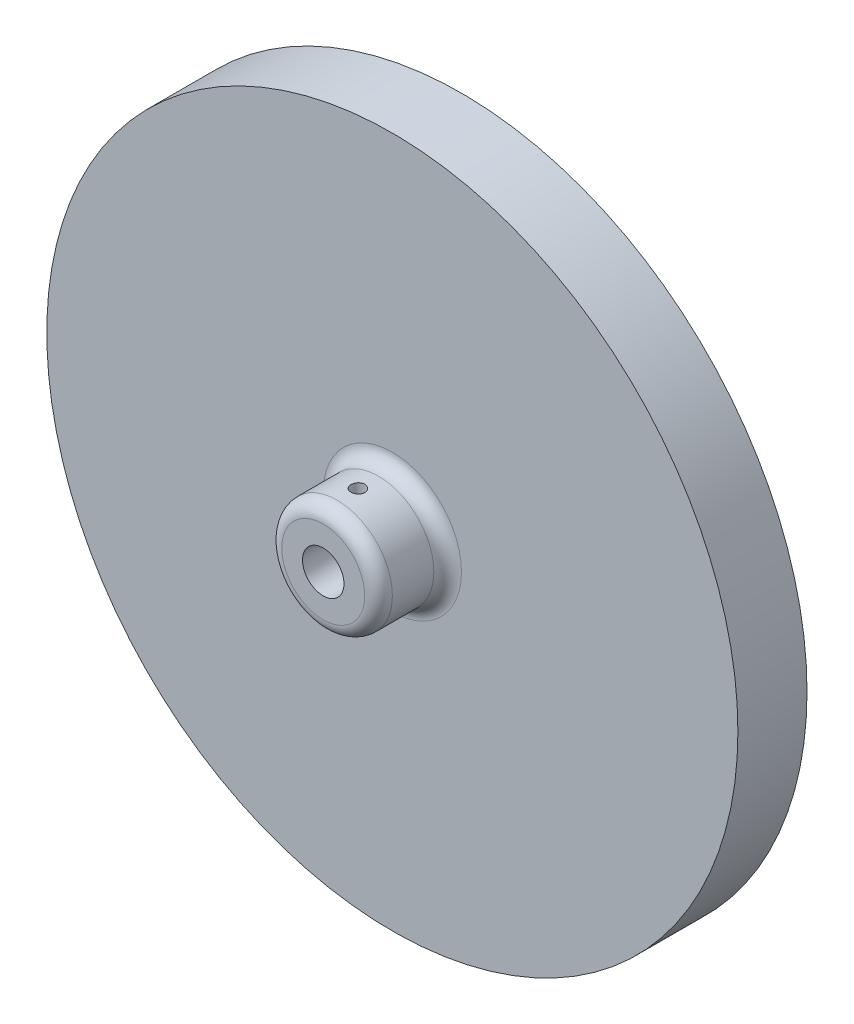
ISO-10303-21;
HEADER;
FILE_DESCRIPTION(('STEP AP214'),'2;1');
FILE_NAME('part.step','',(''),(''),'','','');
FILE_SCHEMA(('AUTOMOTIVE_DESIGN { 1 0 10303 214 1 1 1 1 }'));
ENDSEC;
DATA;
#1=APPLICATION_CONTEXT('core data for automotive mechanical design processes');
#2=APPLICATION_PROTOCOL_DEFINITION('international standard','automotive_design',2000,#1);
#3=PRODUCT_CONTEXT('',#1,'mechanical');
#4=PRODUCT('Part','Part','',(#3));
#5=PRODUCT_RELATED_PRODUCT_CATEGORY('part','',(#4));
#6=PRODUCT_DEFINITION_FORMATION('','',#4);
#7=PRODUCT_DEFINITION_CONTEXT('part definition',#1,'design');
#8=PRODUCT_DEFINITION('design','',#6,#7);
#9=PRODUCT_DEFINITION_SHAPE('','',#8);
#10=(LENGTH_UNIT() NAMED_UNIT(*) SI_UNIT(.MILLI.,.METRE.));
#11=(NAMED_UNIT(*) PLANE_ANGLE_UNIT() SI_UNIT($,.RADIAN.));
#12=(NAMED_UNIT(*) SI_UNIT($,.STERADIAN.) SOLID_ANGLE_UNIT());
#13=UNCERTAINTY_MEASURE_WITH_UNIT(LENGTH_MEASURE(1.E-05),#10,'distance_accuracy_value','');
#14=(GEOMETRIC_REPRESENTATION_CONTEXT(3) GLOBAL_UNCERTAINTY_ASSIGNED_CONTEXT((#13)) GLOBAL_UNIT_ASSIGNED_CONTEXT((#10,
#11,#12)) REPRESENTATION_CONTEXT('',''));
#15=CARTESIAN_POINT('',(0.,0.,0.));
#16=DIRECTION('',(0.,0.,1.));
#17=DIRECTION('',(1.,0.,0.));
#18=AXIS2_PLACEMENT_3D('',#15,#16,#17);
#19=CARTESIAN_POINT('',(0.,0.,5.));
#20=DIRECTION('',(0.,0.,-1.));
#21=DIRECTION('',(-1.,0.,0.));
#22=AXIS2_PLACEMENT_3D('',#19,#20,#21);
#23=CYLINDRICAL_SURFACE('',#22,50.);
#24=CARTESIAN_POINT('',(0.,0.,5.));
#25=DIRECTION('',(0.,0.,1.));
#26=DIRECTION('',(1.,0.,0.));
#27=AXIS2_PLACEMENT_3D('',#24,#25,#26);
#28=CIRCLE('',#27,50.);
#29=CARTESIAN_POINT('',(50.,0.,5.));
#30=VERTEX_POINT('',#29);
#31=EDGE_CURVE('E107',#30,#30,#28,.T.);
#32=ORIENTED_EDGE('',*,*,#31,.F.);
#33=EDGE_LOOP('',(#32));
#34=FACE_BOUND('',#33,.T.);
#35=CARTESIAN_POINT('',(0.,0.,-5.));
#36=DIRECTION('',(0.,0.,1.));
#37=DIRECTION('',(1.,0.,0.));
#38=AXIS2_PLACEMENT_3D('',#35,#36,#37);
#39=CIRCLE('',#38,50.);
#40=CARTESIAN_POINT('',(50.,0.,-5.));
#41=VERTEX_POINT('',#40);
#42=EDGE_CURVE('E111',#41,#41,#39,.T.);
#43=ORIENTED_EDGE('',*,*,#42,.T.);
#44=EDGE_LOOP('',(#43));
#45=FACE_BOUND('',#44,.T.);
#46=ADVANCED_FACE('F30',(#34,#45),#23,.T.);
#47=CARTESIAN_POINT('',(0.,0.,5.));
#48=DIRECTION('',(0.,0.,1.));
#49=DIRECTION('',(1.,0.,0.));
#50=AXIS2_PLACEMENT_3D('',#47,#48,#49);
#51=PLANE('',#50);
#52=CARTESIAN_POINT('',(0.,0.,5.));
#53=DIRECTION('',(0.,0.,1.));
#54=DIRECTION('',(1.,0.,0.));
#55=AXIS2_PLACEMENT_3D('',#52,#53,#54);
#56=CIRCLE('',#55,10.);
#57=CARTESIAN_POINT('',(10.,0.,5.));
#58=VERTEX_POINT('',#57);
#59=EDGE_CURVE('E10',#58,#58,#56,.F.);
#60=ORIENTED_EDGE('',*,*,#59,.T.);
#61=EDGE_LOOP('',(#60));
#62=FACE_BOUND('',#61,.T.);
#63=ORIENTED_EDGE('',*,*,#31,.T.);
#64=EDGE_LOOP('',(#63));
#65=FACE_BOUND('',#64,.T.);
#66=ADVANCED_FACE('F83',(#62,#65),#51,.T.);
#67=CARTESIAN_POINT('',(0.,0.,-5.));
#68=DIRECTION('',(0.,0.,1.));
#69=DIRECTION('',(1.,0.,0.));
#70=AXIS2_PLACEMENT_3D('',#67,#68,#69);
#71=PLANE('',#70);
#72=CARTESIAN_POINT('',(0.,0.,-5.));
#73=DIRECTION('',(0.,0.,1.));
#74=DIRECTION('',(1.,0.,0.));
#75=AXIS2_PLACEMENT_3D('',#72,#73,#74);
#76=CIRCLE('',#75,3.);
#77=CARTESIAN_POINT('',(3.,0.,-5.));
#78=VERTEX_POINT('',#77);
#79=EDGE_CURVE('E115',#78,#78,#76,.T.);
#80=ORIENTED_EDGE('',*,*,#79,.T.);
#81=EDGE_LOOP('',(#80));
#82=FACE_BOUND('',#81,.T.);
#83=ORIENTED_EDGE('',*,*,#42,.F.);
#84=EDGE_LOOP('',(#83));
#85=FACE_BOUND('',#84,.T.);
#86=ADVANCED_FACE('F81',(#82,#85),#71,.F.);
#87=CARTESIAN_POINT('',(0.,0.,15.));
#88=DIRECTION('',(0.,0.,-1.));
#89=DIRECTION('',(-1.,0.,0.));
#90=AXIS2_PLACEMENT_3D('',#87,#88,#89);
#91=CYLINDRICAL_SURFACE('',#90,8.);
#92=CARTESIAN_POINT('',(0.,-8.,11.));
#93=CARTESIAN_POINT('',(0.0559364382223045,-7.99999921958571,10.9999976236257));
#94=CARTESIAN_POINT('',(0.111907829721099,-7.99940713821961,10.9952908483323));
#95=CARTESIAN_POINT('',(0.222293120835901,-7.99710216044544,10.9765888981717));
#96=CARTESIAN_POINT('',(0.276705332249498,-7.99538809376571,10.9625840248306));
#97=CARTESIAN_POINT('',(0.382358229925222,-7.99103224417762,10.9257049424344));
#98=CARTESIAN_POINT('',(0.433601024058456,-7.98839108582217,10.9028367032761));
#99=CARTESIAN_POINT('',(0.531511789957215,-7.98247480351239,10.8488930864121));
#100=CARTESIAN_POINT('',(0.578180544622549,-7.97919978833646,10.8178191165877));
#101=CARTESIAN_POINT('',(0.665885126772527,-7.9723612852253,10.7481632200642));
#102=CARTESIAN_POINT('',(0.706892145974851,-7.96879645876967,10.7095451482615));
#103=CARTESIAN_POINT('',(0.781861117422998,-7.961790904039,10.6259748705853));
#104=CARTESIAN_POINT('',(0.815822710556901,-7.95835018209707,10.5810223420347));
#105=CARTESIAN_POINT('',(0.875844064513576,-7.95196922247834,10.4858720089737));
#106=CARTESIAN_POINT('',(0.901876838376429,-7.94903070871164,10.4356570553728));
#107=CARTESIAN_POINT('',(0.945129230630047,-7.94400451383073,10.3315251792211));
#108=CARTESIAN_POINT('',(0.962349183226086,-7.94191680045254,10.2776083971412));
#109=CARTESIAN_POINT('',(0.987399592009906,-7.93884135841445,10.1679023217653));
#110=CARTESIAN_POINT('',(0.995278685892681,-7.93784793374698,10.1121242969183));
#111=CARTESIAN_POINT('',(1.00157421982289,-7.93705611257117,10.0000294946113));
#112=CARTESIAN_POINT('',(0.999991040400967,-7.93725766800603,9.94371273890748));
#113=CARTESIAN_POINT('',(0.987446894579161,-7.93882782147901,9.83247806910049));
#114=CARTESIAN_POINT('',(0.976539505193879,-7.94018975184131,9.77755400551989));
#115=CARTESIAN_POINT('',(0.94574015327282,-7.94391679903051,9.6703219915124));
#116=CARTESIAN_POINT('',(0.925848008700761,-7.94628193618289,9.61801409411438));
#117=CARTESIAN_POINT('',(0.87758622396466,-7.9517564634586,9.51733280039132));
#118=CARTESIAN_POINT('',(0.849193301483054,-7.95486789284578,9.4689706799004));
#119=CARTESIAN_POINT('',(0.784752587782767,-7.96148284572239,9.3776773222347));
#120=CARTESIAN_POINT('',(0.74870444643231,-7.96498638714265,9.33474633361053));
#121=CARTESIAN_POINT('',(0.669679644301511,-7.9720204395617,9.2552229157109));
#122=CARTESIAN_POINT('',(0.626656803136005,-7.97555096954756,9.21867636329361));
#123=CARTESIAN_POINT('',(0.53506286764557,-7.98221853022341,9.15331644798778));
#124=CARTESIAN_POINT('',(0.486491760527301,-7.98535556000602,9.1245031029312));
#125=CARTESIAN_POINT('',(0.385144668545392,-7.99088460887432,9.07542747181443));
#126=CARTESIAN_POINT('',(0.332367278135087,-7.99327637760615,9.05516805844751));
#127=CARTESIAN_POINT('',(0.224123176172422,-7.99704314312025,9.0238118025907));
#128=CARTESIAN_POINT('',(0.168656590652266,-7.99841818750348,9.01271453114518));
#129=CARTESIAN_POINT('',(0.0570052655653982,-7.99999038564304,9.00005703029578));
#130=CARTESIAN_POINT('',(0.000827796079442151,-8.00019534457054,8.99843360305437));
#131=CARTESIAN_POINT('',(-0.110998414598999,-7.99942535202172,9.00460309362238));
#132=CARTESIAN_POINT('',(-0.166647167025883,-7.99845042567285,9.01239581090064));
#133=CARTESIAN_POINT('',(-0.275649803088609,-7.99543507502677,9.03712388350975));
#134=CARTESIAN_POINT('',(-0.329010628169883,-7.99339816325548,9.05402910536105));
#135=CARTESIAN_POINT('',(-0.432139861943363,-7.98848689240079,9.09647098076517));
#136=CARTESIAN_POINT('',(-0.481908148586126,-7.98561250488249,9.12200792739657));
#137=CARTESIAN_POINT('',(-0.576721808274971,-7.97932729164045,9.18114125500298));
#138=CARTESIAN_POINT('',(-0.621741503977528,-7.97591377617004,9.21477851592226));
#139=CARTESIAN_POINT('',(-0.705518795850528,-7.96894056930262,9.28909979901368));
#140=CARTESIAN_POINT('',(-0.744276143334744,-7.96538087210759,9.3297841009004));
#141=CARTESIAN_POINT('',(-0.814652783527207,-7.95849242185034,9.41732296670286));
#142=CARTESIAN_POINT('',(-0.846230184227173,-7.9551650988853,9.46421133852416));
#143=CARTESIAN_POINT('',(-0.901061155777402,-7.94914164414859,9.56266329794189));
#144=CARTESIAN_POINT('',(-0.924314893491347,-7.94644549972411,9.61422679179061));
#145=CARTESIAN_POINT('',(-0.961770631546616,-7.94199940157198,9.72043012765905));
#146=CARTESIAN_POINT('',(-0.975996250982844,-7.94024698073915,9.77506153201919));
#147=CARTESIAN_POINT('',(-0.995067997547139,-7.93787966362982,9.88596099351227));
#148=CARTESIAN_POINT('',(-0.999914561014305,-7.93726471443511,9.9422289743836));
#149=CARTESIAN_POINT('',(-1.00008261443393,-7.93724350792982,10.0543875716819));
#150=CARTESIAN_POINT('',(-0.99546991907971,-7.93782889900781,10.1102780993328));
#151=CARTESIAN_POINT('',(-0.976989761939731,-7.94012445814881,10.220482851738));
#152=CARTESIAN_POINT('',(-0.963122299162308,-7.94183462633232,10.2747970763235));
#153=CARTESIAN_POINT('',(-0.926546829475863,-7.9461844630982,10.3802987827066));
#154=CARTESIAN_POINT('',(-0.903841992388373,-7.94882379837113,10.4314873780087));
#155=CARTESIAN_POINT('',(-0.850242760860123,-7.95473513297927,10.5293386616193));
#156=CARTESIAN_POINT('',(-0.819348263803835,-7.95800714024165,10.5760012932079));
#157=CARTESIAN_POINT('',(-0.750002532506335,-7.96484241900893,10.6638124901362));
#158=CARTESIAN_POINT('',(-0.711502250309984,-7.96840748833613,10.704922184382));
#159=CARTESIAN_POINT('',(-0.628140090787354,-7.9754113263716,10.7801227300672));
#160=CARTESIAN_POINT('',(-0.583276715656627,-7.97885006510236,10.8142119243097));
#161=CARTESIAN_POINT('',(-0.488266248341684,-7.98522822634699,10.8745141428421));
#162=CARTESIAN_POINT('',(-0.438099711838468,-7.98816570031321,10.9006967223597));
#163=CARTESIAN_POINT('',(-0.334073160920512,-7.9931905963069,10.9442284971665));
#164=CARTESIAN_POINT('',(-0.280217232348094,-7.9952789414783,10.9615872905414));
#165=CARTESIAN_POINT('',(-0.18840230878717,-7.99786688131098,10.9828237352685));
#166=CARTESIAN_POINT('',(-0.151022265406768,-7.99866290358181,10.9892555767928));
#167=CARTESIAN_POINT('',(-0.075766825284974,-7.99972972531675,10.9978444982773));
#168=CARTESIAN_POINT('',(-0.0378914321984109,-8.00000052865388,11.0000016097597));
#169=CARTESIAN_POINT('',(0.,-8.,11.));
#170=B_SPLINE_CURVE_WITH_KNOTS('',3,(#92,#93,#94,#95,#96,#97,#98,#99,#100,#101,#102,#103,#104,
#105,#106,#107,#108,#109,#110,#111,#112,#113,#114,#115,#116,#117,#118,#119,#120,#121,#122,#123,
#124,#125,#126,#127,#128,#129,#130,#131,#132,#133,#134,#135,#136,#137,#138,#139,#140,#141,#142,
#143,#144,#145,#146,#147,#148,#149,#150,#151,#152,#153,#154,#155,#156,#157,#158,#159,#160,#161,
#162,#163,#164,#165,#166,#167,#168,#169),.UNSPECIFIED.,.T.,.F.,(4,2,2,2,2,2,2,2,2,2,2,2,2,2,2,2,
2,2,2,2,2,2,2,2,2,2,2,2,2,2,2,2,2,2,2,2,2,2,4),(0.,0.167670909110499,0.335516984377371,
0.503250203272709,0.670954662364293,0.839483252807373,1.00802043120004,1.17712500127548,
1.34622315798723,1.51443690114528,1.68264387953865,1.84989078576677,2.01714108066497,
2.18485370514214,2.35257400205455,2.52145391254567,2.69033421245245,2.85927118292642,
3.02820024361512,3.19600111756769,3.36379841800772,3.53104421557358,3.69829569231579,
3.86640961171369,4.03453020550035,4.2036078860303,4.37268217688616,4.5413122971237,
4.70993457204249,4.87738760480886,5.04484065551819,5.21223369882595,5.37962883964906,
5.54814095076732,5.71669279388005,5.88588561214742,6.05489399473613,6.16847537275052,
6.28205591320175),.UNSPECIFIED.);
#171=CARTESIAN_POINT('',(0.,-8.,11.));
#172=VERTEX_POINT('',#171);
#173=EDGE_CURVE('E72',#172,#172,#170,.T.);
#174=ORIENTED_EDGE('',*,*,#173,.T.);
#175=EDGE_LOOP('',(#174));
#176=FACE_BOUND('',#175,.T.);
#177=CARTESIAN_POINT('',(0.,8.,11.));
#178=CARTESIAN_POINT('',(-0.0559364382223045,7.99999921958571,10.9999976236257));
#179=CARTESIAN_POINT('',(-0.111907829721099,7.99940713821961,10.9952908483323));
#180=CARTESIAN_POINT('',(-0.222293120835901,7.99710216044544,10.9765888981717));
#181=CARTESIAN_POINT('',(-0.276705332249498,7.99538809376571,10.9625840248306));
#182=CARTESIAN_POINT('',(-0.382358229925222,7.99103224417762,10.9257049424344));
#183=CARTESIAN_POINT('',(-0.433601024058456,7.98839108582217,10.9028367032761));
#184=CARTESIAN_POINT('',(-0.531511789957215,7.98247480351239,10.8488930864121));
#185=CARTESIAN_POINT('',(-0.578180544622549,7.97919978833646,10.8178191165877));
#186=CARTESIAN_POINT('',(-0.665885126772527,7.9723612852253,10.7481632200642));
#187=CARTESIAN_POINT('',(-0.706892145974851,7.96879645876967,10.7095451482615));
#188=CARTESIAN_POINT('',(-0.781861117422998,7.961790904039,10.6259748705853));
#189=CARTESIAN_POINT('',(-0.815822710556901,7.95835018209707,10.5810223420347));
#190=CARTESIAN_POINT('',(-0.875844064513576,7.95196922247834,10.4858720089737));
#191=CARTESIAN_POINT('',(-0.901876838376429,7.94903070871164,10.4356570553728));
#192=CARTESIAN_POINT('',(-0.945129230630047,7.94400451383073,10.3315251792211));
#193=CARTESIAN_POINT('',(-0.962349183226086,7.94191680045254,10.2776083971412));
#194=CARTESIAN_POINT('',(-0.987399592009906,7.93884135841445,10.1679023217653));
#195=CARTESIAN_POINT('',(-0.995278685892681,7.93784793374698,10.1121242969183));
#196=CARTESIAN_POINT('',(-1.00157421982289,7.93705611257117,10.0000294946113));
#197=CARTESIAN_POINT('',(-0.999991040400967,7.93725766800603,9.94371273890748));
#198=CARTESIAN_POINT('',(-0.987446894579161,7.93882782147901,9.83247806910049));
#199=CARTESIAN_POINT('',(-0.976539505193879,7.94018975184131,9.77755400551989));
#200=CARTESIAN_POINT('',(-0.94574015327282,7.94391679903051,9.6703219915124));
#201=CARTESIAN_POINT('',(-0.925848008700761,7.94628193618289,9.61801409411438));
#202=CARTESIAN_POINT('',(-0.87758622396466,7.9517564634586,9.51733280039132));
#203=CARTESIAN_POINT('',(-0.849193301483054,7.95486789284578,9.4689706799004));
#204=CARTESIAN_POINT('',(-0.784752587782767,7.96148284572239,9.3776773222347));
#205=CARTESIAN_POINT('',(-0.74870444643231,7.96498638714265,9.33474633361053));
#206=CARTESIAN_POINT('',(-0.669679644301511,7.9720204395617,9.2552229157109));
#207=CARTESIAN_POINT('',(-0.626656803136005,7.97555096954756,9.21867636329361));
#208=CARTESIAN_POINT('',(-0.53506286764557,7.98221853022341,9.15331644798778));
#209=CARTESIAN_POINT('',(-0.486491760527301,7.98535556000602,9.1245031029312));
#210=CARTESIAN_POINT('',(-0.385144668545392,7.99088460887432,9.07542747181443));
#211=CARTESIAN_POINT('',(-0.332367278135087,7.99327637760615,9.05516805844751));
#212=CARTESIAN_POINT('',(-0.224123176172422,7.99704314312025,9.0238118025907));
#213=CARTESIAN_POINT('',(-0.168656590652266,7.99841818750348,9.01271453114518));
#214=CARTESIAN_POINT('',(-0.0570052655653982,7.99999038564304,9.00005703029578));
#215=CARTESIAN_POINT('',(-0.000827796079442151,8.00019534457054,8.99843360305437));
#216=CARTESIAN_POINT('',(0.110998414598999,7.99942535202172,9.00460309362238));
#217=CARTESIAN_POINT('',(0.166647167025883,7.99845042567285,9.01239581090064));
#218=CARTESIAN_POINT('',(0.275649803088609,7.99543507502677,9.03712388350975));
#219=CARTESIAN_POINT('',(0.329010628169883,7.99339816325548,9.05402910536105));
#220=CARTESIAN_POINT('',(0.432139861943363,7.98848689240079,9.09647098076517));
#221=CARTESIAN_POINT('',(0.481908148586126,7.98561250488249,9.12200792739657));
#222=CARTESIAN_POINT('',(0.576721808274971,7.97932729164045,9.18114125500298));
#223=CARTESIAN_POINT('',(0.621741503977528,7.97591377617004,9.21477851592226));
#224=CARTESIAN_POINT('',(0.705518795850528,7.96894056930262,9.28909979901368));
#225=CARTESIAN_POINT('',(0.744276143334744,7.96538087210759,9.3297841009004));
#226=CARTESIAN_POINT('',(0.814652783527207,7.95849242185034,9.41732296670286));
#227=CARTESIAN_POINT('',(0.846230184227173,7.9551650988853,9.46421133852416));
#228=CARTESIAN_POINT('',(0.901061155777402,7.94914164414859,9.56266329794189));
#229=CARTESIAN_POINT('',(0.924314893491347,7.94644549972411,9.61422679179061));
#230=CARTESIAN_POINT('',(0.961770631546616,7.94199940157198,9.72043012765905));
#231=CARTESIAN_POINT('',(0.975996250982844,7.94024698073915,9.77506153201919));
#232=CARTESIAN_POINT('',(0.995067997547139,7.93787966362982,9.88596099351227));
#233=CARTESIAN_POINT('',(0.999914561014305,7.93726471443511,9.9422289743836));
#234=CARTESIAN_POINT('',(1.00008261443393,7.93724350792982,10.0543875716819));
#235=CARTESIAN_POINT('',(0.99546991907971,7.93782889900781,10.1102780993328));
#236=CARTESIAN_POINT('',(0.976989761939731,7.94012445814881,10.220482851738));
#237=CARTESIAN_POINT('',(0.963122299162308,7.94183462633232,10.2747970763235));
#238=CARTESIAN_POINT('',(0.926546829475863,7.9461844630982,10.3802987827066));
#239=CARTESIAN_POINT('',(0.903841992388373,7.94882379837113,10.4314873780087));
#240=CARTESIAN_POINT('',(0.850242760860123,7.95473513297927,10.5293386616193));
#241=CARTESIAN_POINT('',(0.819348263803835,7.95800714024165,10.5760012932079));
#242=CARTESIAN_POINT('',(0.750002532506335,7.96484241900893,10.6638124901362));
#243=CARTESIAN_POINT('',(0.711502250309984,7.96840748833613,10.704922184382));
#244=CARTESIAN_POINT('',(0.628140090787354,7.9754113263716,10.7801227300672));
#245=CARTESIAN_POINT('',(0.583276715656627,7.97885006510236,10.8142119243097));
#246=CARTESIAN_POINT('',(0.488266248341684,7.98522822634699,10.8745141428421));
#247=CARTESIAN_POINT('',(0.438099711838468,7.98816570031321,10.9006967223597));
#248=CARTESIAN_POINT('',(0.334073160920512,7.9931905963069,10.9442284971665));
#249=CARTESIAN_POINT('',(0.280217232348094,7.9952789414783,10.9615872905414));
#250=CARTESIAN_POINT('',(0.18840230878717,7.99786688131098,10.9828237352685));
#251=CARTESIAN_POINT('',(0.151022265406768,7.99866290358181,10.9892555767928));
#252=CARTESIAN_POINT('',(0.075766825284974,7.99972972531675,10.9978444982773));
#253=CARTESIAN_POINT('',(0.0378914321984109,8.00000052865388,11.0000016097597));
#254=CARTESIAN_POINT('',(0.,8.,11.));
#255=B_SPLINE_CURVE_WITH_KNOTS('',3,(#177,#178,#179,#180,#181,#182,#183,#184,#185,#186,#187,
#188,#189,#190,#191,#192,#193,#194,#195,#196,#197,#198,#199,#200,#201,#202,#203,#204,#205,#206,
#207,#208,#209,#210,#211,#212,#213,#214,#215,#216,#217,#218,#219,#220,#221,#222,#223,#224,#225,
#226,#227,#228,#229,#230,#231,#232,#233,#234,#235,#236,#237,#238,#239,#240,#241,#242,#243,#244,
#245,#246,#247,#248,#249,#250,#251,#252,#253,#254),.UNSPECIFIED.,.T.,.F.,(4,2,2,2,2,2,2,2,2,2,2,
2,2,2,2,2,2,2,2,2,2,2,2,2,2,2,2,2,2,2,2,2,2,2,2,2,2,2,4),(0.,0.167670909110499,
0.335516984377371,0.503250203272709,0.670954662364293,0.839483252807373,1.00802043120004,
1.17712500127548,1.34622315798723,1.51443690114528,1.68264387953865,1.84989078576677,
2.01714108066497,2.18485370514214,2.35257400205455,2.52145391254567,2.69033421245245,
2.85927118292642,3.02820024361512,3.19600111756769,3.36379841800772,3.53104421557358,
3.69829569231579,3.86640961171369,4.03453020550035,4.2036078860303,4.37268217688616,
4.5413122971237,4.70993457204249,4.87738760480886,5.04484065551819,5.21223369882595,
5.37962883964906,5.54814095076732,5.71669279388005,5.88588561214742,6.05489399473613,
6.16847537275052,6.28205591320175),.UNSPECIFIED.);
#256=CARTESIAN_POINT('',(0.,8.,11.));
#257=VERTEX_POINT('',#256);
#258=EDGE_CURVE('E67',#257,#257,#255,.T.);
#259=ORIENTED_EDGE('',*,*,#258,.T.);
#260=EDGE_LOOP('',(#259));
#261=FACE_BOUND('',#260,.T.);
#262=CARTESIAN_POINT('',(0.,0.,13.));
#263=DIRECTION('',(0.,0.,1.));
#264=DIRECTION('',(1.,0.,0.));
#265=AXIS2_PLACEMENT_3D('',#262,#263,#264);
#266=CIRCLE('',#265,8.);
#267=CARTESIAN_POINT('',(8.,0.,13.));
#268=VERTEX_POINT('',#267);
#269=EDGE_CURVE('E42',#268,#268,#266,.F.);
#270=ORIENTED_EDGE('',*,*,#269,.T.);
#271=EDGE_LOOP('',(#270));
#272=FACE_BOUND('',#271,.T.);
#273=CARTESIAN_POINT('',(0.,0.,7.));
#274=DIRECTION('',(0.,0.,1.));
#275=DIRECTION('',(1.,0.,0.));
#276=AXIS2_PLACEMENT_3D('',#273,#274,#275);
#277=CIRCLE('',#276,8.);
#278=CARTESIAN_POINT('',(8.,0.,7.));
#279=VERTEX_POINT('',#278);
#280=EDGE_CURVE('E47',#279,#279,#277,.T.);
#281=ORIENTED_EDGE('',*,*,#280,.T.);
#282=EDGE_LOOP('',(#281));
#283=FACE_BOUND('',#282,.T.);
#284=ADVANCED_FACE('F76',(#176,#261,#272,#283),#91,.T.);
#285=CARTESIAN_POINT('',(0.,0.,15.));
#286=DIRECTION('',(0.,0.,1.));
#287=DIRECTION('',(1.,0.,0.));
#288=AXIS2_PLACEMENT_3D('',#285,#286,#287);
#289=PLANE('',#288);
#290=CARTESIAN_POINT('',(0.,0.,15.));
#291=DIRECTION('',(0.,0.,1.));
#292=DIRECTION('',(1.,0.,0.));
#293=AXIS2_PLACEMENT_3D('',#290,#291,#292);
#294=CIRCLE('',#293,6.);
#295=CARTESIAN_POINT('',(6.,0.,15.));
#296=VERTEX_POINT('',#295);
#297=EDGE_CURVE('E105',#296,#296,#294,.T.);
#298=ORIENTED_EDGE('',*,*,#297,.T.);
#299=EDGE_LOOP('',(#298));
#300=FACE_BOUND('',#299,.T.);
#301=CARTESIAN_POINT('',(0.,0.,15.));
#302=DIRECTION('',(0.,0.,1.));
#303=DIRECTION('',(1.,0.,0.));
#304=AXIS2_PLACEMENT_3D('',#301,#302,#303);
#305=CIRCLE('',#304,3.);
#306=CARTESIAN_POINT('',(3.,0.,15.));
#307=VERTEX_POINT('',#306);
#308=EDGE_CURVE('E117',#307,#307,#305,.T.);
#309=ORIENTED_EDGE('',*,*,#308,.F.);
#310=EDGE_LOOP('',(#309));
#311=FACE_BOUND('',#310,.T.);
#312=ADVANCED_FACE('F80',(#300,#311),#289,.T.);
#313=CARTESIAN_POINT('',(0.,0.,-5.));
#314=DIRECTION('',(0.,0.,1.));
#315=DIRECTION('',(1.,0.,0.));
#316=AXIS2_PLACEMENT_3D('',#313,#314,#315);
#317=CYLINDRICAL_SURFACE('',#316,3.);
#318=CARTESIAN_POINT('',(0.,-3.,11.));
#319=CARTESIAN_POINT('',(-0.0545633628867233,-3.00000015300944,11.0000002537316));
#320=CARTESIAN_POINT('',(-0.10912519453855,-2.99849769507545,10.9955197338728));
#321=CARTESIAN_POINT('',(-0.216641760872972,-2.99265210203281,10.9777708911828));
#322=CARTESIAN_POINT('',(-0.269596328118818,-2.98830867202153,10.9645016560511));
#323=CARTESIAN_POINT('',(-0.372332789501777,-2.97725307906443,10.929680756616));
#324=CARTESIAN_POINT('',(-0.422119825886035,-2.97054487730854,10.9081429375407));
#325=CARTESIAN_POINT('',(-0.517374936805326,-2.95544445717342,10.8574588271617));
#326=CARTESIAN_POINT('',(-0.562842156958706,-2.94705190667778,10.8283110349974));
#327=CARTESIAN_POINT('',(-0.649741675022267,-2.92914094443005,10.7621741951412));
#328=CARTESIAN_POINT('',(-0.69100370029831,-2.91959556463785,10.7249687657395));
#329=CARTESIAN_POINT('',(-0.766832692702084,-2.90060314783122,10.6442328452934));
#330=CARTESIAN_POINT('',(-0.801398185489463,-2.89115613290549,10.6007009650715));
#331=CARTESIAN_POINT('',(-0.863824942227859,-2.87313332477274,10.5070148848035));
#332=CARTESIAN_POINT('',(-0.891464858221032,-2.86459039275688,10.4567062602679));
#333=CARTESIAN_POINT('',(-0.937818873877722,-2.84975305418601,10.3518239055415));
#334=CARTESIAN_POINT('',(-0.956535697386765,-2.84345796160746,10.2972514828373));
#335=CARTESIAN_POINT('',(-0.983873461509164,-2.83411303269378,10.1873267785033));
#336=CARTESIAN_POINT('',(-0.992813448271769,-2.83096095769612,10.1320627915109));
#337=CARTESIAN_POINT('',(-1.00134112333448,-2.82795656629508,10.0207362458441));
#338=CARTESIAN_POINT('',(-1.00093170160472,-2.8281032302273,9.96467393929081));
#339=CARTESIAN_POINT('',(-0.991019903703419,-2.8315901500818,9.85606336955598));
#340=CARTESIAN_POINT('',(-0.981933913166995,-2.83478415867533,9.80347159708098));
#341=CARTESIAN_POINT('',(-0.955606162849417,-2.84376657724551,9.70060658039317));
#342=CARTESIAN_POINT('',(-0.93836342659187,-2.84955529784108,9.65033361456493));
#343=CARTESIAN_POINT('',(-0.89593905806021,-2.86317911131249,9.55258725040852));
#344=CARTESIAN_POINT('',(-0.870634048707262,-2.87104565793118,9.50517197453047));
#345=CARTESIAN_POINT('',(-0.812889106303138,-2.88792558575727,9.41512909172027));
#346=CARTESIAN_POINT('',(-0.780447112364005,-2.89693929790464,9.37250287306662));
#347=CARTESIAN_POINT('',(-0.707349332682237,-2.91567329167741,9.29090840183922));
#348=CARTESIAN_POINT('',(-0.66635315007631,-2.92540589354843,9.25224730549093));
#349=CARTESIAN_POINT('',(-0.578339569970063,-2.94406938387037,9.1822687333366));
#350=CARTESIAN_POINT('',(-0.531321595660814,-2.95300019538068,9.1509519618355));
#351=CARTESIAN_POINT('',(-0.431947613046267,-2.96917107937794,9.09630369976493));
#352=CARTESIAN_POINT('',(-0.379543276416336,-2.9763935000804,9.07305450865927));
#353=CARTESIAN_POINT('',(-0.271269083364508,-2.98820567144435,9.03579682604429));
#354=CARTESIAN_POINT('',(-0.215400438154954,-2.99279633654879,9.02178512457656));
#355=CARTESIAN_POINT('',(-0.104383829529303,-2.99867627071441,9.00394433397764));
#356=CARTESIAN_POINT('',(-0.0493095998648447,-3.00010001833731,8.99970019082725));
#357=CARTESIAN_POINT('',(0.0607750699602371,-2.99988902694825,9.00033267359847));
#358=CARTESIAN_POINT('',(0.115785519319648,-2.99825480419353,9.00520775997987));
#359=CARTESIAN_POINT('',(0.22251986630426,-2.99220024717114,9.02361190773597));
#360=CARTESIAN_POINT('',(0.274292806834857,-2.98786198711228,9.03688620604952));
#361=CARTESIAN_POINT('',(0.374855958579561,-2.97691846830034,9.0713934444667));
#362=CARTESIAN_POINT('',(0.42364578850856,-2.97031292046541,9.09262739946768));
#363=CARTESIAN_POINT('',(0.518288296393322,-2.95528931287427,9.1430704318409));
#364=CARTESIAN_POINT('',(0.56402995921733,-2.94682814756305,9.1724745932836));
#365=CARTESIAN_POINT('',(0.650064830135404,-2.92905253915744,9.23819415001305));
#366=CARTESIAN_POINT('',(0.690356367794894,-2.91973783591888,9.27451165603016));
#367=CARTESIAN_POINT('',(0.766252507807014,-2.90076847982473,9.35497875100826));
#368=CARTESIAN_POINT('',(0.801560969248492,-2.89111761095156,9.39940922693325));
#369=CARTESIAN_POINT('',(0.864257522320854,-2.87299973286981,9.4937715678045));
#370=CARTESIAN_POINT('',(0.891645547920843,-2.8645327335312,9.5437034786102));
#371=CARTESIAN_POINT('',(0.937596930423361,-2.84982391820308,9.64767301530659));
#372=CARTESIAN_POINT('',(0.956178132197766,-2.84357760900632,9.70170207924278));
#373=CARTESIAN_POINT('',(0.983894666792163,-2.83410832399134,9.81237865012415));
#374=CARTESIAN_POINT('',(0.993034254961244,-2.83088398622699,9.86902496543306));
#375=CARTESIAN_POINT('',(1.00127628247038,-2.82797858875071,9.98019709601321));
#376=CARTESIAN_POINT('',(1.00087025731093,-2.82812400344299,10.0346823402517));
#377=CARTESIAN_POINT('',(0.991242293454878,-2.8315126992356,10.1427650748997));
#378=CARTESIAN_POINT('',(0.982020879458887,-2.83475579595884,10.1963626179529));
#379=CARTESIAN_POINT('',(0.95537181312698,-2.84384524278944,10.3001356630127));
#380=CARTESIAN_POINT('',(0.93810334601488,-2.84964098015514,10.3503568250072));
#381=CARTESIAN_POINT('',(0.895979365760382,-2.86316398825434,10.4472274069355));
#382=CARTESIAN_POINT('',(0.87112216855398,-2.87089168765297,10.4938760311873));
#383=CARTESIAN_POINT('',(0.813260692583249,-2.8878282922406,10.5844836699237));
#384=CARTESIAN_POINT('',(0.779948242764532,-2.89708711641604,10.6282365018986));
#385=CARTESIAN_POINT('',(0.706642883135697,-2.91583356283786,10.709689813384));
#386=CARTESIAN_POINT('',(0.666648084451495,-2.92532124912518,10.747388575688));
#387=CARTESIAN_POINT('',(0.579241556920674,-2.94390030525393,10.8171444122892));
#388=CARTESIAN_POINT('',(0.531601513499725,-2.95296181801216,10.848924347751));
#389=CARTESIAN_POINT('',(0.431357357406628,-2.96925991172653,10.9039904288506));
#390=CARTESIAN_POINT('',(0.378754518132349,-2.97649695907941,10.927278745922));
#391=CARTESIAN_POINT('',(0.272493647200975,-2.98805515068532,10.9637216324887));
#392=CARTESIAN_POINT('',(0.218987757676408,-2.9924921242252,10.9772824662634));
#393=CARTESIAN_POINT('',(0.110320416010247,-2.99846407064225,10.9954202806771));
#394=CARTESIAN_POINT('',(0.0551594255687465,-2.99999984531906,10.9999997434965));
#395=CARTESIAN_POINT('',(0.,-3.,11.));
#396=B_SPLINE_CURVE_WITH_KNOTS('',3,(#318,#319,#320,#321,#322,#323,#324,#325,#326,#327,#328,
#329,#330,#331,#332,#333,#334,#335,#336,#337,#338,#339,#340,#341,#342,#343,#344,#345,#346,#347,
#348,#349,#350,#351,#352,#353,#354,#355,#356,#357,#358,#359,#360,#361,#362,#363,#364,#365,#366,
#367,#368,#369,#370,#371,#372,#373,#374,#375,#376,#377,#378,#379,#380,#381,#382,#383,#384,#385,
#386,#387,#388,#389,#390,#391,#392,#393,#394,#395),.UNSPECIFIED.,.T.,.F.,(4,2,2,2,2,2,2,2,2,2,2,
2,2,2,2,2,2,2,2,2,2,2,2,2,2,2,2,2,2,2,2,2,2,2,2,2,2,2,4),(0.,0.163487106026011,
0.326991185267521,0.490222672870275,0.653486377799101,0.82184684282756,0.990244332875303,
1.1634838482347,1.33667044692833,1.5040192574184,1.67131633987485,1.8309682655128,
1.99063930855482,2.15288171155131,2.31517102558207,2.48593305811367,2.65671145966618,
2.82918405650357,3.00159668877208,3.1665358317517,3.33144713164177,3.49158157978214,
3.65173645284104,3.81610399843736,3.98052180821891,4.15241022880752,4.32430008234997,
4.49584013824416,4.66730284700846,4.82995666056619,4.99260079341185,5.15215587070227,
5.31174638165787,5.47830066681615,5.64490211113589,5.8179966082491,5.99104681142266,
6.15636558363624,6.3216386602795),.UNSPECIFIED.);
#397=CARTESIAN_POINT('',(0.,-3.,11.));
#398=VERTEX_POINT('',#397);
#399=EDGE_CURVE('E34',#398,#398,#396,.T.);
#400=ORIENTED_EDGE('',*,*,#399,.T.);
#401=EDGE_LOOP('',(#400));
#402=FACE_BOUND('',#401,.T.);
#403=CARTESIAN_POINT('',(0.,3.,11.));
#404=CARTESIAN_POINT('',(0.0545633628867233,3.00000015300944,11.0000002537316));
#405=CARTESIAN_POINT('',(0.10912519453855,2.99849769507545,10.9955197338728));
#406=CARTESIAN_POINT('',(0.216641760872972,2.99265210203281,10.9777708911828));
#407=CARTESIAN_POINT('',(0.269596328118818,2.98830867202153,10.9645016560511));
#408=CARTESIAN_POINT('',(0.372332789501777,2.97725307906443,10.929680756616));
#409=CARTESIAN_POINT('',(0.422119825886035,2.97054487730854,10.9081429375407));
#410=CARTESIAN_POINT('',(0.517374936805326,2.95544445717342,10.8574588271617));
#411=CARTESIAN_POINT('',(0.562842156958706,2.94705190667778,10.8283110349974));
#412=CARTESIAN_POINT('',(0.649741675022267,2.92914094443005,10.7621741951412));
#413=CARTESIAN_POINT('',(0.69100370029831,2.91959556463785,10.7249687657395));
#414=CARTESIAN_POINT('',(0.766832692702084,2.90060314783122,10.6442328452934));
#415=CARTESIAN_POINT('',(0.801398185489463,2.89115613290549,10.6007009650715));
#416=CARTESIAN_POINT('',(0.863824942227859,2.87313332477274,10.5070148848035));
#417=CARTESIAN_POINT('',(0.891464858221032,2.86459039275688,10.4567062602679));
#418=CARTESIAN_POINT('',(0.937818873877722,2.84975305418601,10.3518239055415));
#419=CARTESIAN_POINT('',(0.956535697386765,2.84345796160746,10.2972514828373));
#420=CARTESIAN_POINT('',(0.983873461509164,2.83411303269378,10.1873267785033));
#421=CARTESIAN_POINT('',(0.992813448271769,2.83096095769612,10.1320627915109));
#422=CARTESIAN_POINT('',(1.00134112333448,2.82795656629508,10.0207362458441));
#423=CARTESIAN_POINT('',(1.00093170160472,2.8281032302273,9.96467393929081));
#424=CARTESIAN_POINT('',(0.991019903703419,2.8315901500818,9.85606336955598));
#425=CARTESIAN_POINT('',(0.981933913166995,2.83478415867533,9.80347159708098));
#426=CARTESIAN_POINT('',(0.955606162849417,2.84376657724551,9.70060658039317));
#427=CARTESIAN_POINT('',(0.93836342659187,2.84955529784108,9.65033361456493));
#428=CARTESIAN_POINT('',(0.89593905806021,2.86317911131249,9.55258725040852));
#429=CARTESIAN_POINT('',(0.870634048707262,2.87104565793118,9.50517197453047));
#430=CARTESIAN_POINT('',(0.812889106303138,2.88792558575727,9.41512909172027));
#431=CARTESIAN_POINT('',(0.780447112364005,2.89693929790464,9.37250287306662));
#432=CARTESIAN_POINT('',(0.707349332682237,2.91567329167741,9.29090840183922));
#433=CARTESIAN_POINT('',(0.66635315007631,2.92540589354843,9.25224730549093));
#434=CARTESIAN_POINT('',(0.578339569970063,2.94406938387037,9.1822687333366));
#435=CARTESIAN_POINT('',(0.531321595660814,2.95300019538068,9.1509519618355));
#436=CARTESIAN_POINT('',(0.431947613046267,2.96917107937794,9.09630369976493));
#437=CARTESIAN_POINT('',(0.379543276416336,2.9763935000804,9.07305450865927));
#438=CARTESIAN_POINT('',(0.271269083364508,2.98820567144435,9.03579682604429));
#439=CARTESIAN_POINT('',(0.215400438154954,2.99279633654879,9.02178512457656));
#440=CARTESIAN_POINT('',(0.104383829529303,2.99867627071441,9.00394433397764));
#441=CARTESIAN_POINT('',(0.0493095998648447,3.00010001833731,8.99970019082725));
#442=CARTESIAN_POINT('',(-0.0607750699602371,2.99988902694825,9.00033267359847));
#443=CARTESIAN_POINT('',(-0.115785519319648,2.99825480419353,9.00520775997987));
#444=CARTESIAN_POINT('',(-0.22251986630426,2.99220024717114,9.02361190773597));
#445=CARTESIAN_POINT('',(-0.274292806834857,2.98786198711228,9.03688620604952));
#446=CARTESIAN_POINT('',(-0.374855958579561,2.97691846830034,9.0713934444667));
#447=CARTESIAN_POINT('',(-0.42364578850856,2.97031292046541,9.09262739946768));
#448=CARTESIAN_POINT('',(-0.518288296393322,2.95528931287427,9.1430704318409));
#449=CARTESIAN_POINT('',(-0.56402995921733,2.94682814756305,9.1724745932836));
#450=CARTESIAN_POINT('',(-0.650064830135404,2.92905253915744,9.23819415001305));
#451=CARTESIAN_POINT('',(-0.690356367794894,2.91973783591888,9.27451165603016));
#452=CARTESIAN_POINT('',(-0.766252507807014,2.90076847982473,9.35497875100826));
#453=CARTESIAN_POINT('',(-0.801560969248492,2.89111761095156,9.39940922693325));
#454=CARTESIAN_POINT('',(-0.864257522320854,2.87299973286981,9.4937715678045));
#455=CARTESIAN_POINT('',(-0.891645547920843,2.8645327335312,9.5437034786102));
#456=CARTESIAN_POINT('',(-0.937596930423361,2.84982391820308,9.64767301530659));
#457=CARTESIAN_POINT('',(-0.956178132197766,2.84357760900632,9.70170207924278));
#458=CARTESIAN_POINT('',(-0.983894666792163,2.83410832399134,9.81237865012415));
#459=CARTESIAN_POINT('',(-0.993034254961244,2.83088398622699,9.86902496543306));
#460=CARTESIAN_POINT('',(-1.00127628247038,2.82797858875071,9.98019709601321));
#461=CARTESIAN_POINT('',(-1.00087025731093,2.82812400344299,10.0346823402517));
#462=CARTESIAN_POINT('',(-0.991242293454878,2.8315126992356,10.1427650748997));
#463=CARTESIAN_POINT('',(-0.982020879458887,2.83475579595884,10.1963626179529));
#464=CARTESIAN_POINT('',(-0.95537181312698,2.84384524278944,10.3001356630127));
#465=CARTESIAN_POINT('',(-0.93810334601488,2.84964098015514,10.3503568250072));
#466=CARTESIAN_POINT('',(-0.895979365760382,2.86316398825434,10.4472274069355));
#467=CARTESIAN_POINT('',(-0.87112216855398,2.87089168765297,10.4938760311873));
#468=CARTESIAN_POINT('',(-0.813260692583249,2.8878282922406,10.5844836699237));
#469=CARTESIAN_POINT('',(-0.779948242764532,2.89708711641604,10.6282365018986));
#470=CARTESIAN_POINT('',(-0.706642883135697,2.91583356283786,10.709689813384));
#471=CARTESIAN_POINT('',(-0.666648084451495,2.92532124912518,10.747388575688));
#472=CARTESIAN_POINT('',(-0.579241556920674,2.94390030525393,10.8171444122892));
#473=CARTESIAN_POINT('',(-0.531601513499725,2.95296181801216,10.848924347751));
#474=CARTESIAN_POINT('',(-0.431357357406628,2.96925991172653,10.9039904288506));
#475=CARTESIAN_POINT('',(-0.378754518132349,2.97649695907941,10.927278745922));
#476=CARTESIAN_POINT('',(-0.272493647200975,2.98805515068532,10.9637216324887));
#477=CARTESIAN_POINT('',(-0.218987757676408,2.9924921242252,10.9772824662634));
#478=CARTESIAN_POINT('',(-0.110320416010247,2.99846407064225,10.9954202806771));
#479=CARTESIAN_POINT('',(-0.0551594255687465,2.99999984531906,10.9999997434965));
#480=CARTESIAN_POINT('',(0.,3.,11.));
#481=B_SPLINE_CURVE_WITH_KNOTS('',3,(#403,#404,#405,#406,#407,#408,#409,#410,#411,#412,#413,
#414,#415,#416,#417,#418,#419,#420,#421,#422,#423,#424,#425,#426,#427,#428,#429,#430,#431,#432,
#433,#434,#435,#436,#437,#438,#439,#440,#441,#442,#443,#444,#445,#446,#447,#448,#449,#450,#451,
#452,#453,#454,#455,#456,#457,#458,#459,#460,#461,#462,#463,#464,#465,#466,#467,#468,#469,#470,
#471,#472,#473,#474,#475,#476,#477,#478,#479,#480),.UNSPECIFIED.,.T.,.F.,(4,2,2,2,2,2,2,2,2,2,2,
2,2,2,2,2,2,2,2,2,2,2,2,2,2,2,2,2,2,2,2,2,2,2,2,2,2,2,4),(0.,0.163487106026011,
0.326991185267521,0.490222672870275,0.653486377799101,0.82184684282756,0.990244332875303,
1.1634838482347,1.33667044692833,1.5040192574184,1.67131633987485,1.8309682655128,
1.99063930855482,2.15288171155131,2.31517102558207,2.48593305811367,2.65671145966618,
2.82918405650357,3.00159668877208,3.1665358317517,3.33144713164177,3.49158157978214,
3.65173645284104,3.81610399843736,3.98052180821891,4.15241022880752,4.32430008234997,
4.49584013824416,4.66730284700846,4.82995666056619,4.99260079341185,5.15215587070227,
5.31174638165787,5.47830066681615,5.64490211113589,5.8179966082491,5.99104681142266,
6.15636558363624,6.3216386602795),.UNSPECIFIED.);
#482=CARTESIAN_POINT('',(0.,3.,11.));
#483=VERTEX_POINT('',#482);
#484=EDGE_CURVE('E50',#483,#483,#481,.T.);
#485=ORIENTED_EDGE('',*,*,#484,.T.);
#486=EDGE_LOOP('',(#485));
#487=FACE_BOUND('',#486,.T.);
#488=ORIENTED_EDGE('',*,*,#79,.F.);
#489=EDGE_LOOP('',(#488));
#490=FACE_BOUND('',#489,.T.);
#491=ORIENTED_EDGE('',*,*,#308,.T.);
#492=EDGE_LOOP('',(#491));
#493=FACE_BOUND('',#492,.T.);
#494=ADVANCED_FACE('F54',(#402,#487,#490,#493),#317,.F.);
#495=CARTESIAN_POINT('',(0.,0.,13.));
#496=DIRECTION('',(0.,0.,1.));
#497=DIRECTION('',(1.,0.,0.));
#498=AXIS2_PLACEMENT_3D('',#495,#496,#497);
#499=TOROIDAL_SURFACE('',#498,6.,2.);
#500=ORIENTED_EDGE('',*,*,#269,.F.);
#501=EDGE_LOOP('',(#500));
#502=FACE_BOUND('',#501,.T.);
#503=ORIENTED_EDGE('',*,*,#297,.F.);
#504=EDGE_LOOP('',(#503));
#505=FACE_BOUND('',#504,.T.);
#506=ADVANCED_FACE('F92',(#502,#505),#499,.T.);
#507=CARTESIAN_POINT('',(0.,0.,7.));
#508=DIRECTION('',(0.,0.,1.));
#509=DIRECTION('',(1.,0.,0.));
#510=AXIS2_PLACEMENT_3D('',#507,#508,#509);
#511=TOROIDAL_SURFACE('',#510,10.,2.);
#512=ORIENTED_EDGE('',*,*,#59,.F.);
#513=EDGE_LOOP('',(#512));
#514=FACE_BOUND('',#513,.T.);
#515=ORIENTED_EDGE('',*,*,#280,.F.);
#516=EDGE_LOOP('',(#515));
#517=FACE_BOUND('',#516,.T.);
#518=ADVANCED_FACE('F32',(#514,#517),#511,.F.);
#519=CARTESIAN_POINT('',(0.,-50.,10.));
#520=DIRECTION('',(0.,1.,0.));
#521=DIRECTION('',(0.,0.,1.));
#522=AXIS2_PLACEMENT_3D('',#519,#520,#521);
#523=CYLINDRICAL_SURFACE('',#522,1.);
#524=ORIENTED_EDGE('',*,*,#484,.F.);
#525=EDGE_LOOP('',(#524));
#526=FACE_BOUND('',#525,.T.);
#527=ORIENTED_EDGE('',*,*,#258,.F.);
#528=EDGE_LOOP('',(#527));
#529=FACE_BOUND('',#528,.T.);
#530=ADVANCED_FACE('F60',(#526,#529),#523,.F.);
#531=ORIENTED_EDGE('',*,*,#399,.F.);
#532=EDGE_LOOP('',(#531));
#533=FACE_BOUND('',#532,.T.);
#534=ORIENTED_EDGE('',*,*,#173,.F.);
#535=EDGE_LOOP('',(#534));
#536=FACE_BOUND('',#535,.T.);
#537=ADVANCED_FACE('F57',(#533,#536),#523,.F.);
#538=CLOSED_SHELL('',(#46,#66,#86,#284,#312,#494,#506,#518,#530,#537));
#539=MANIFOLD_SOLID_BREP('B2',#538);
#540=ADVANCED_BREP_SHAPE_REPRESENTATION('',(#18,#539),#14);
#541=SHAPE_DEFINITION_REPRESENTATION(#9,#540);
ENDSEC;
END-ISO-10303-21;
